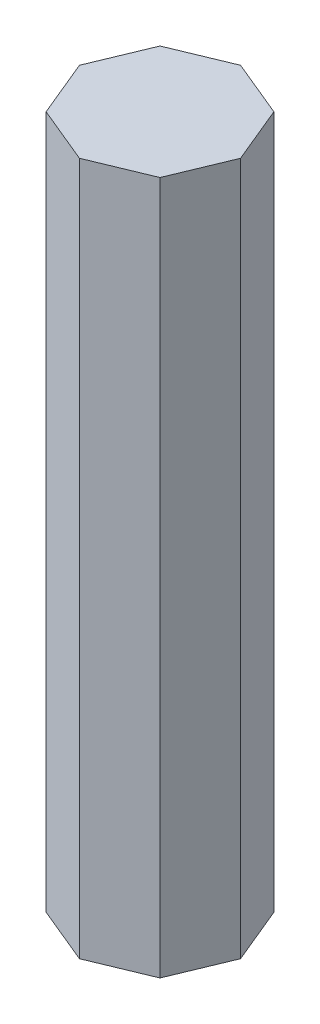
ISO-10303-21;
HEADER;
FILE_DESCRIPTION(('STEP AP214'),'2;1');
FILE_NAME('part.step','',(''),(''),'','','');
FILE_SCHEMA(('AUTOMOTIVE_DESIGN { 1 0 10303 214 1 1 1 1 }'));
ENDSEC;
DATA;
#1=APPLICATION_CONTEXT('core data for automotive mechanical design processes');
#2=APPLICATION_PROTOCOL_DEFINITION('international standard','automotive_design',2000,#1);
#3=PRODUCT_CONTEXT('',#1,'mechanical');
#4=PRODUCT('Part','Part','',(#3));
#5=PRODUCT_RELATED_PRODUCT_CATEGORY('part','',(#4));
#6=PRODUCT_DEFINITION_FORMATION('','',#4);
#7=PRODUCT_DEFINITION_CONTEXT('part definition',#1,'design');
#8=PRODUCT_DEFINITION('design','',#6,#7);
#9=PRODUCT_DEFINITION_SHAPE('','',#8);
#10=(LENGTH_UNIT() NAMED_UNIT(*) SI_UNIT(.MILLI.,.METRE.));
#11=(NAMED_UNIT(*) PLANE_ANGLE_UNIT() SI_UNIT($,.RADIAN.));
#12=(NAMED_UNIT(*) SI_UNIT($,.STERADIAN.) SOLID_ANGLE_UNIT());
#13=UNCERTAINTY_MEASURE_WITH_UNIT(LENGTH_MEASURE(1.E-05),#10,'distance_accuracy_value','');
#14=(GEOMETRIC_REPRESENTATION_CONTEXT(3) GLOBAL_UNCERTAINTY_ASSIGNED_CONTEXT((#13)) GLOBAL_UNIT_ASSIGNED_CONTEXT((#10,
#11,#12)) REPRESENTATION_CONTEXT('',''));
#15=CARTESIAN_POINT('',(0.,0.,0.));
#16=DIRECTION('',(0.,0.,1.));
#17=DIRECTION('',(1.,0.,0.));
#18=AXIS2_PLACEMENT_3D('',#15,#16,#17);
#19=CARTESIAN_POINT('',(41.0756840154518,500.,-41.0756840154518));
#20=DIRECTION('',(-0.38268343236509,0.,0.923879532511287));
#21=DIRECTION('',(0.923879532511287,0.,0.38268343236509));
#22=AXIS2_PLACEMENT_3D('',#19,#20,#21);
#23=PLANE('',#22);
#24=DIRECTION('',(-0.923879532511287,0.,-0.38268343236509));
#25=VECTOR('',#24,1.);
#26=CARTESIAN_POINT('',(41.0756840154518,0.,-41.0756840154518));
#27=LINE('',#26,#25);
#28=CARTESIAN_POINT('',(41.0756840154518,0.,-41.0756840154518));
#29=VERTEX_POINT('',#28);
#30=CARTESIAN_POINT('',(0.,0.,-58.0897894184037));
#31=VERTEX_POINT('',#30);
#32=EDGE_CURVE('E129',#29,#31,#27,.T.);
#33=ORIENTED_EDGE('',*,*,#32,.T.);
#34=DIRECTION('',(0.,-1.,0.));
#35=VECTOR('',#34,1.);
#36=CARTESIAN_POINT('',(0.,500.,-58.0897894184037));
#37=LINE('',#36,#35);
#38=CARTESIAN_POINT('',(0.,500.,-58.0897894184037));
#39=VERTEX_POINT('',#38);
#40=EDGE_CURVE('E11',#39,#31,#37,.T.);
#41=ORIENTED_EDGE('',*,*,#40,.F.);
#42=DIRECTION('',(-0.923879532511287,0.,-0.38268343236509));
#43=VECTOR('',#42,1.);
#44=CARTESIAN_POINT('',(41.0756840154518,500.,-41.0756840154518));
#45=LINE('',#44,#43);
#46=CARTESIAN_POINT('',(41.0756840154518,500.,-41.0756840154518));
#47=VERTEX_POINT('',#46);
#48=EDGE_CURVE('E143',#47,#39,#45,.T.);
#49=ORIENTED_EDGE('',*,*,#48,.F.);
#50=DIRECTION('',(0.,-1.,0.));
#51=VECTOR('',#50,1.);
#52=CARTESIAN_POINT('',(41.0756840154518,500.,-41.0756840154518));
#53=LINE('',#52,#51);
#54=EDGE_CURVE('E125',#47,#29,#53,.T.);
#55=ORIENTED_EDGE('',*,*,#54,.T.);
#56=EDGE_LOOP('',(#33,#41,#49,#55));
#57=FACE_BOUND('',#56,.T.);
#58=ADVANCED_FACE('F33',(#57),#23,.F.);
#59=CARTESIAN_POINT('',(0.,500.,-58.0897894184037));
#60=DIRECTION('',(0.38268343236509,0.,0.923879532511287));
#61=DIRECTION('',(0.923879532511287,0.,-0.38268343236509));
#62=AXIS2_PLACEMENT_3D('',#59,#60,#61);
#63=PLANE('',#62);
#64=DIRECTION('',(-0.923879532511287,0.,0.38268343236509));
#65=VECTOR('',#64,1.);
#66=CARTESIAN_POINT('',(0.,0.,-58.0897894184037));
#67=LINE('',#66,#65);
#68=CARTESIAN_POINT('',(-41.0756840154518,0.,-41.0756840154518));
#69=VERTEX_POINT('',#68);
#70=EDGE_CURVE('E132',#31,#69,#67,.T.);
#71=ORIENTED_EDGE('',*,*,#70,.T.);
#72=DIRECTION('',(0.,-1.,0.));
#73=VECTOR('',#72,1.);
#74=CARTESIAN_POINT('',(-41.0756840154518,500.,-41.0756840154518));
#75=LINE('',#74,#73);
#76=CARTESIAN_POINT('',(-41.0756840154518,500.,-41.0756840154518));
#77=VERTEX_POINT('',#76);
#78=EDGE_CURVE('E41',#77,#69,#75,.T.);
#79=ORIENTED_EDGE('',*,*,#78,.F.);
#80=DIRECTION('',(-0.923879532511287,0.,0.38268343236509));
#81=VECTOR('',#80,1.);
#82=CARTESIAN_POINT('',(0.,500.,-58.0897894184037));
#83=LINE('',#82,#81);
#84=EDGE_CURVE('E92',#39,#77,#83,.T.);
#85=ORIENTED_EDGE('',*,*,#84,.F.);
#86=ORIENTED_EDGE('',*,*,#40,.T.);
#87=EDGE_LOOP('',(#71,#79,#85,#86));
#88=FACE_BOUND('',#87,.T.);
#89=ADVANCED_FACE('F178',(#88),#63,.F.);
#90=CARTESIAN_POINT('',(-41.0756840154518,500.,-41.0756840154518));
#91=DIRECTION('',(0.923879532511287,0.,0.382683432365089));
#92=DIRECTION('',(0.382683432365089,0.,-0.923879532511287));
#93=AXIS2_PLACEMENT_3D('',#90,#91,#92);
#94=PLANE('',#93);
#95=DIRECTION('',(-0.382683432365089,0.,0.923879532511287));
#96=VECTOR('',#95,1.);
#97=CARTESIAN_POINT('',(-41.0756840154518,0.,-41.0756840154518));
#98=LINE('',#97,#96);
#99=CARTESIAN_POINT('',(-58.0897894184037,0.,0.));
#100=VERTEX_POINT('',#99);
#101=EDGE_CURVE('E134',#69,#100,#98,.T.);
#102=ORIENTED_EDGE('',*,*,#101,.T.);
#103=DIRECTION('',(0.,-1.,0.));
#104=VECTOR('',#103,1.);
#105=CARTESIAN_POINT('',(-58.0897894184037,500.,0.));
#106=LINE('',#105,#104);
#107=CARTESIAN_POINT('',(-58.0897894184037,500.,0.));
#108=VERTEX_POINT('',#107);
#109=EDGE_CURVE('E150',#108,#100,#106,.T.);
#110=ORIENTED_EDGE('',*,*,#109,.F.);
#111=DIRECTION('',(-0.382683432365089,0.,0.923879532511287));
#112=VECTOR('',#111,1.);
#113=CARTESIAN_POINT('',(-41.0756840154518,500.,-41.0756840154518));
#114=LINE('',#113,#112);
#115=EDGE_CURVE('E158',#77,#108,#114,.T.);
#116=ORIENTED_EDGE('',*,*,#115,.F.);
#117=ORIENTED_EDGE('',*,*,#78,.T.);
#118=EDGE_LOOP('',(#102,#110,#116,#117));
#119=FACE_BOUND('',#118,.T.);
#120=ADVANCED_FACE('F156',(#119),#94,.F.);
#121=CARTESIAN_POINT('',(-58.0897894184037,500.,0.));
#122=DIRECTION('',(0.923879532511287,0.,-0.38268343236509));
#123=DIRECTION('',(-0.38268343236509,0.,-0.923879532511287));
#124=AXIS2_PLACEMENT_3D('',#121,#122,#123);
#125=PLANE('',#124);
#126=DIRECTION('',(0.38268343236509,0.,0.923879532511287));
#127=VECTOR('',#126,1.);
#128=CARTESIAN_POINT('',(-58.0897894184037,0.,0.));
#129=LINE('',#128,#127);
#130=CARTESIAN_POINT('',(-41.0756840154518,0.,41.0756840154518));
#131=VERTEX_POINT('',#130);
#132=EDGE_CURVE('E136',#100,#131,#129,.T.);
#133=ORIENTED_EDGE('',*,*,#132,.T.);
#134=DIRECTION('',(0.,-1.,0.));
#135=VECTOR('',#134,1.);
#136=CARTESIAN_POINT('',(-41.0756840154518,500.,41.0756840154518));
#137=LINE('',#136,#135);
#138=CARTESIAN_POINT('',(-41.0756840154518,500.,41.0756840154518));
#139=VERTEX_POINT('',#138);
#140=EDGE_CURVE('E147',#139,#131,#137,.T.);
#141=ORIENTED_EDGE('',*,*,#140,.F.);
#142=DIRECTION('',(0.38268343236509,0.,0.923879532511287));
#143=VECTOR('',#142,1.);
#144=CARTESIAN_POINT('',(-58.0897894184037,500.,0.));
#145=LINE('',#144,#143);
#146=EDGE_CURVE('E170',#108,#139,#145,.T.);
#147=ORIENTED_EDGE('',*,*,#146,.F.);
#148=ORIENTED_EDGE('',*,*,#109,.T.);
#149=EDGE_LOOP('',(#133,#141,#147,#148));
#150=FACE_BOUND('',#149,.T.);
#151=ADVANCED_FACE('F166',(#150),#125,.F.);
#152=CARTESIAN_POINT('',(-41.0756840154518,500.,41.0756840154518));
#153=DIRECTION('',(0.38268343236509,0.,-0.923879532511287));
#154=DIRECTION('',(-0.923879532511287,0.,-0.38268343236509));
#155=AXIS2_PLACEMENT_3D('',#152,#153,#154);
#156=PLANE('',#155);
#157=DIRECTION('',(0.923879532511287,0.,0.38268343236509));
#158=VECTOR('',#157,1.);
#159=CARTESIAN_POINT('',(-41.0756840154518,0.,41.0756840154518));
#160=LINE('',#159,#158);
#161=CARTESIAN_POINT('',(0.,0.,58.0897894184037));
#162=VERTEX_POINT('',#161);
#163=EDGE_CURVE('E138',#131,#162,#160,.T.);
#164=ORIENTED_EDGE('',*,*,#163,.T.);
#165=DIRECTION('',(0.,-1.,0.));
#166=VECTOR('',#165,1.);
#167=CARTESIAN_POINT('',(0.,500.,58.0897894184037));
#168=LINE('',#167,#166);
#169=CARTESIAN_POINT('',(0.,500.,58.0897894184037));
#170=VERTEX_POINT('',#169);
#171=EDGE_CURVE('E120',#170,#162,#168,.T.);
#172=ORIENTED_EDGE('',*,*,#171,.F.);
#173=DIRECTION('',(0.923879532511287,0.,0.38268343236509));
#174=VECTOR('',#173,1.);
#175=CARTESIAN_POINT('',(-41.0756840154518,500.,41.0756840154518));
#176=LINE('',#175,#174);
#177=EDGE_CURVE('E111',#139,#170,#176,.T.);
#178=ORIENTED_EDGE('',*,*,#177,.F.);
#179=ORIENTED_EDGE('',*,*,#140,.T.);
#180=EDGE_LOOP('',(#164,#172,#178,#179));
#181=FACE_BOUND('',#180,.T.);
#182=ADVANCED_FACE('F169',(#181),#156,.F.);
#183=CARTESIAN_POINT('',(0.,500.,58.0897894184037));
#184=DIRECTION('',(-0.38268343236509,0.,-0.923879532511287));
#185=DIRECTION('',(-0.923879532511287,0.,0.38268343236509));
#186=AXIS2_PLACEMENT_3D('',#183,#184,#185);
#187=PLANE('',#186);
#188=DIRECTION('',(0.923879532511287,0.,-0.38268343236509));
#189=VECTOR('',#188,1.);
#190=CARTESIAN_POINT('',(0.,0.,58.0897894184037));
#191=LINE('',#190,#189);
#192=CARTESIAN_POINT('',(41.0756840154518,0.,41.0756840154518));
#193=VERTEX_POINT('',#192);
#194=EDGE_CURVE('E119',#162,#193,#191,.T.);
#195=ORIENTED_EDGE('',*,*,#194,.T.);
#196=DIRECTION('',(0.,-1.,0.));
#197=VECTOR('',#196,1.);
#198=CARTESIAN_POINT('',(41.0756840154518,500.,41.0756840154518));
#199=LINE('',#198,#197);
#200=CARTESIAN_POINT('',(41.0756840154518,500.,41.0756840154518));
#201=VERTEX_POINT('',#200);
#202=EDGE_CURVE('E116',#201,#193,#199,.T.);
#203=ORIENTED_EDGE('',*,*,#202,.F.);
#204=DIRECTION('',(0.923879532511287,0.,-0.38268343236509));
#205=VECTOR('',#204,1.);
#206=CARTESIAN_POINT('',(0.,500.,58.0897894184037));
#207=LINE('',#206,#205);
#208=EDGE_CURVE('E105',#170,#201,#207,.T.);
#209=ORIENTED_EDGE('',*,*,#208,.F.);
#210=ORIENTED_EDGE('',*,*,#171,.T.);
#211=EDGE_LOOP('',(#195,#203,#209,#210));
#212=FACE_BOUND('',#211,.T.);
#213=ADVANCED_FACE('F117',(#212),#187,.F.);
#214=CARTESIAN_POINT('',(41.0756840154518,500.,41.0756840154518));
#215=DIRECTION('',(-0.923879532511287,0.,-0.38268343236509));
#216=DIRECTION('',(-0.38268343236509,0.,0.923879532511287));
#217=AXIS2_PLACEMENT_3D('',#214,#215,#216);
#218=PLANE('',#217);
#219=DIRECTION('',(0.38268343236509,0.,-0.923879532511287));
#220=VECTOR('',#219,1.);
#221=CARTESIAN_POINT('',(41.0756840154518,0.,41.0756840154518));
#222=LINE('',#221,#220);
#223=CARTESIAN_POINT('',(58.0897894184037,0.,0.));
#224=VERTEX_POINT('',#223);
#225=EDGE_CURVE('E78',#193,#224,#222,.T.);
#226=ORIENTED_EDGE('',*,*,#225,.T.);
#227=DIRECTION('',(0.,-1.,0.));
#228=VECTOR('',#227,1.);
#229=CARTESIAN_POINT('',(58.0897894184037,500.,0.));
#230=LINE('',#229,#228);
#231=CARTESIAN_POINT('',(58.0897894184037,500.,0.));
#232=VERTEX_POINT('',#231);
#233=EDGE_CURVE('E121',#232,#224,#230,.T.);
#234=ORIENTED_EDGE('',*,*,#233,.F.);
#235=DIRECTION('',(0.38268343236509,0.,-0.923879532511287));
#236=VECTOR('',#235,1.);
#237=CARTESIAN_POINT('',(41.0756840154518,500.,41.0756840154518));
#238=LINE('',#237,#236);
#239=EDGE_CURVE('E109',#201,#232,#238,.T.);
#240=ORIENTED_EDGE('',*,*,#239,.F.);
#241=ORIENTED_EDGE('',*,*,#202,.T.);
#242=EDGE_LOOP('',(#226,#234,#240,#241));
#243=FACE_BOUND('',#242,.T.);
#244=ADVANCED_FACE('F123',(#243),#218,.F.);
#245=CARTESIAN_POINT('',(58.0897894184037,500.,0.));
#246=DIRECTION('',(-0.923879532511287,0.,0.38268343236509));
#247=DIRECTION('',(0.38268343236509,0.,0.923879532511287));
#248=AXIS2_PLACEMENT_3D('',#245,#246,#247);
#249=PLANE('',#248);
#250=DIRECTION('',(-0.38268343236509,0.,-0.923879532511287));
#251=VECTOR('',#250,1.);
#252=CARTESIAN_POINT('',(58.0897894184037,0.,0.));
#253=LINE('',#252,#251);
#254=EDGE_CURVE('E84',#224,#29,#253,.T.);
#255=ORIENTED_EDGE('',*,*,#254,.T.);
#256=ORIENTED_EDGE('',*,*,#54,.F.);
#257=DIRECTION('',(-0.38268343236509,0.,-0.923879532511287));
#258=VECTOR('',#257,1.);
#259=CARTESIAN_POINT('',(58.0897894184037,500.,0.));
#260=LINE('',#259,#258);
#261=EDGE_CURVE('E49',#232,#47,#260,.T.);
#262=ORIENTED_EDGE('',*,*,#261,.F.);
#263=ORIENTED_EDGE('',*,*,#233,.T.);
#264=EDGE_LOOP('',(#255,#256,#262,#263));
#265=FACE_BOUND('',#264,.T.);
#266=ADVANCED_FACE('F194',(#265),#249,.F.);
#267=CARTESIAN_POINT('',(0.,500.,0.));
#268=DIRECTION('',(0.,1.,0.));
#269=DIRECTION('',(0.,0.,1.));
#270=AXIS2_PLACEMENT_3D('',#267,#268,#269);
#271=PLANE('',#270);
#272=ORIENTED_EDGE('',*,*,#48,.T.);
#273=ORIENTED_EDGE('',*,*,#84,.T.);
#274=ORIENTED_EDGE('',*,*,#115,.T.);
#275=ORIENTED_EDGE('',*,*,#146,.T.);
#276=ORIENTED_EDGE('',*,*,#177,.T.);
#277=ORIENTED_EDGE('',*,*,#208,.T.);
#278=ORIENTED_EDGE('',*,*,#239,.T.);
#279=ORIENTED_EDGE('',*,*,#261,.T.);
#280=EDGE_LOOP('',(#272,#273,#274,#275,#276,#277,#278,#279));
#281=FACE_BOUND('',#280,.T.);
#282=ADVANCED_FACE('F107',(#281),#271,.T.);
#283=CARTESIAN_POINT('',(0.,0.,0.));
#284=DIRECTION('',(0.,1.,0.));
#285=DIRECTION('',(0.,0.,1.));
#286=AXIS2_PLACEMENT_3D('',#283,#284,#285);
#287=PLANE('',#286);
#288=ORIENTED_EDGE('',*,*,#32,.F.);
#289=ORIENTED_EDGE('',*,*,#254,.F.);
#290=ORIENTED_EDGE('',*,*,#225,.F.);
#291=ORIENTED_EDGE('',*,*,#194,.F.);
#292=ORIENTED_EDGE('',*,*,#163,.F.);
#293=ORIENTED_EDGE('',*,*,#132,.F.);
#294=ORIENTED_EDGE('',*,*,#101,.F.);
#295=ORIENTED_EDGE('',*,*,#70,.F.);
#296=EDGE_LOOP('',(#288,#289,#290,#291,#292,#293,#294,#295));
#297=FACE_BOUND('',#296,.T.);
#298=ADVANCED_FACE('F162',(#297),#287,.F.);
#299=CLOSED_SHELL('',(#58,#89,#120,#151,#182,#213,#244,#266,#282,#298));
#300=MANIFOLD_SOLID_BREP('B2',#299);
#301=ADVANCED_BREP_SHAPE_REPRESENTATION('',(#18,#300),#14);
#302=SHAPE_DEFINITION_REPRESENTATION(#9,#301);
ENDSEC;
END-ISO-10303-21;
